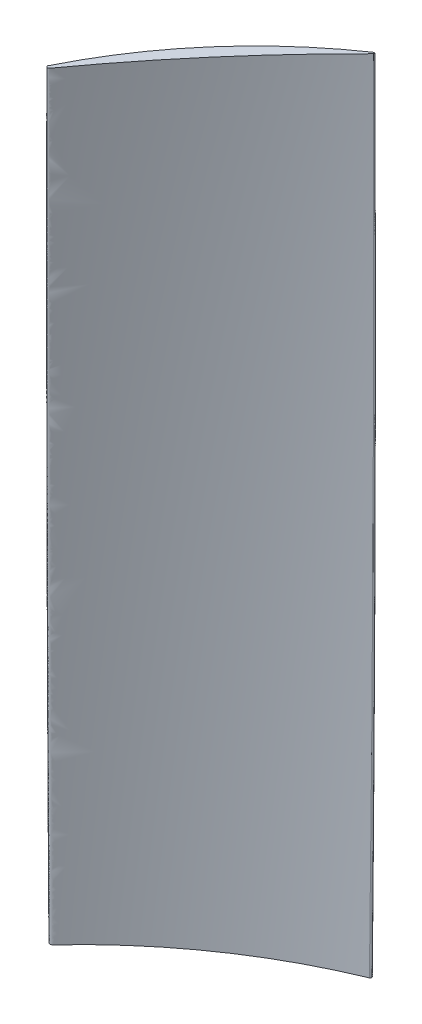
ISO-10303-21;
HEADER;
FILE_DESCRIPTION(('STEP AP214'),'2;1');
FILE_NAME('part.step','',(''),(''),'','','');
FILE_SCHEMA(('AUTOMOTIVE_DESIGN { 1 0 10303 214 1 1 1 1 }'));
ENDSEC;
DATA;
#1=APPLICATION_CONTEXT('core data for automotive mechanical design processes');
#2=APPLICATION_PROTOCOL_DEFINITION('international standard','automotive_design',2000,#1);
#3=PRODUCT_CONTEXT('',#1,'mechanical');
#4=PRODUCT('Part','Part','',(#3));
#5=PRODUCT_RELATED_PRODUCT_CATEGORY('part','',(#4));
#6=PRODUCT_DEFINITION_FORMATION('','',#4);
#7=PRODUCT_DEFINITION_CONTEXT('part definition',#1,'design');
#8=PRODUCT_DEFINITION('design','',#6,#7);
#9=PRODUCT_DEFINITION_SHAPE('','',#8);
#10=(LENGTH_UNIT() NAMED_UNIT(*) SI_UNIT(.MILLI.,.METRE.));
#11=(NAMED_UNIT(*) PLANE_ANGLE_UNIT() SI_UNIT($,.RADIAN.));
#12=(NAMED_UNIT(*) SI_UNIT($,.STERADIAN.) SOLID_ANGLE_UNIT());
#13=UNCERTAINTY_MEASURE_WITH_UNIT(LENGTH_MEASURE(1.E-05),#10,'distance_accuracy_value','');
#14=(GEOMETRIC_REPRESENTATION_CONTEXT(3) GLOBAL_UNCERTAINTY_ASSIGNED_CONTEXT((#13)) GLOBAL_UNIT_ASSIGNED_CONTEXT((#10,
#11,#12)) REPRESENTATION_CONTEXT('',''));
#15=CARTESIAN_POINT('',(0.,0.,0.));
#16=DIRECTION('',(0.,0.,1.));
#17=DIRECTION('',(1.,0.,0.));
#18=AXIS2_PLACEMENT_3D('',#15,#16,#17);
#19=CARTESIAN_POINT('',(21.7386034138477,422.,10.5574587035433));
#20=DIRECTION('',(0.,-1.,0.));
#21=DIRECTION('',(0.,0.,-1.));
#22=AXIS2_PLACEMENT_3D('',#19,#20,#21);
#23=PLANE('',#22);
#24=CARTESIAN_POINT('',(34.9313622856881,422.,29.8563887749535));
#25=DIRECTION('',(0.,1.,0.));
#26=DIRECTION('',(0.,0.,-1.));
#27=AXIS2_PLACEMENT_3D('',#24,#25,#26);
#28=CIRCLE('',#27,46.8445757568905);
#29=CARTESIAN_POINT('',(8.49505386412198,422.,-8.81577013663156));
#30=VERTEX_POINT('',#29);
#31=CARTESIAN_POINT('',(-7.04997074761576,422.,9.07221319375984));
#32=VERTEX_POINT('',#31);
#33=EDGE_CURVE('E212',#30,#32,#28,.T.);
#34=ORIENTED_EDGE('',*,*,#33,.T.);
#35=CARTESIAN_POINT('',(-6.95572437402814,422.,9.22556775373632));
#36=DIRECTION('',(0.,1.,0.));
#37=DIRECTION('',(0.,0.,1.));
#38=AXIS2_PLACEMENT_3D('',#35,#36,#37);
#39=CIRCLE('',#38,0.179999999999992);
#40=CARTESIAN_POINT('',(-6.80979712214955,422.,9.33094914279132));
#41=VERTEX_POINT('',#40);
#42=EDGE_CURVE('E275',#32,#41,#39,.T.);
#43=ORIENTED_EDGE('',*,*,#42,.T.);
#44=CARTESIAN_POINT('',(109.597584654928,422.,93.3945591265566));
#45=DIRECTION('',(0.,-1.,0.));
#46=DIRECTION('',(0.,0.,-1.));
#47=AXIS2_PLACEMENT_3D('',#44,#45,#46);
#48=CIRCLE('',#47,143.587496167657);
#49=CARTESIAN_POINT('',(8.60914364487819,422.,-8.6774930623584));
#50=VERTEX_POINT('',#49);
#51=EDGE_CURVE('E205',#41,#50,#48,.T.);
#52=ORIENTED_EDGE('',*,*,#51,.T.);
#53=CARTESIAN_POINT('',(8.54584454200725,422.,-8.74147136786686));
#54=DIRECTION('',(0.,1.,0.));
#55=DIRECTION('',(0.,0.,1.));
#56=AXIS2_PLACEMENT_3D('',#53,#54,#55);
#57=CIRCLE('',#56,0.0899999999999799);
#58=EDGE_CURVE('E209',#50,#30,#57,.T.);
#59=ORIENTED_EDGE('',*,*,#58,.T.);
#60=EDGE_LOOP('',(#34,#43,#52,#59));
#61=FACE_BOUND('',#60,.T.);
#62=ADVANCED_FACE('F167',(#61),#23,.F.);
#63=CARTESIAN_POINT('',(15.1224626774868,342.,10.7175696282854));
#64=DIRECTION('',(0.,-1.,0.));
#65=DIRECTION('',(0.,0.,-1.));
#66=AXIS2_PLACEMENT_3D('',#63,#64,#65);
#67=PLANE('',#66);
#68=CARTESIAN_POINT('',(19.3057491735808,342.,27.4352228342268));
#69=DIRECTION('',(0.,1.,0.));
#70=DIRECTION('',(0.,0.,-1.));
#71=AXIS2_PLACEMENT_3D('',#68,#69,#70);
#72=CIRCLE('',#71,34.6162045849278);
#73=CARTESIAN_POINT('',(10.9027641085955,342.,-6.14559701674188));
#74=VERTEX_POINT('',#73);
#75=CARTESIAN_POINT('',(-8.6912377469834,342.,7.07716931147229));
#76=VERTEX_POINT('',#75);
#77=EDGE_CURVE('E320',#74,#76,#72,.T.);
#78=ORIENTED_EDGE('',*,*,#77,.F.);
#79=CARTESIAN_POINT('',(10.9391761813929,342.,-6.00008357765601));
#80=DIRECTION('',(0.,1.,0.));
#81=DIRECTION('',(0.,0.,1.));
#82=AXIS2_PLACEMENT_3D('',#79,#80,#81);
#83=CIRCLE('',#82,0.150000000000004);
#84=CARTESIAN_POINT('',(10.9963050588019,342.,-5.86138861968712));
#85=VERTEX_POINT('',#84);
#86=EDGE_CURVE('E321',#85,#74,#83,.T.);
#87=ORIENTED_EDGE('',*,*,#86,.F.);
#88=CARTESIAN_POINT('',(31.8550502492999,342.,44.7785489860895));
#89=DIRECTION('',(0.,-1.,0.));
#90=DIRECTION('',(0.,0.,-1.));
#91=AXIS2_PLACEMENT_3D('',#88,#89,#90);
#92=CIRCLE('',#91,54.7676047644872);
#93=CARTESIAN_POINT('',(-8.27383653023069,342.,7.50707225823914));
#94=VERTEX_POINT('',#93);
#95=EDGE_CURVE('E178',#94,#85,#92,.T.);
#96=ORIENTED_EDGE('',*,*,#95,.F.);
#97=CARTESIAN_POINT('',(-8.49365016067205,342.,7.30291063630153));
#98=DIRECTION('',(0.,1.,0.));
#99=DIRECTION('',(0.,0.,1.));
#100=AXIS2_PLACEMENT_3D('',#97,#98,#99);
#101=CIRCLE('',#100,0.300000000000008);
#102=EDGE_CURVE('E12',#76,#94,#101,.T.);
#103=ORIENTED_EDGE('',*,*,#102,.F.);
#104=EDGE_LOOP('',(#78,#87,#96,#103));
#105=FACE_BOUND('',#104,.T.);
#106=ADVANCED_FACE('F247',(#105),#67,.T.);
#107=CARTESIAN_POINT('',(10.9963050588019,342.,-5.86138861968712));
#108=CARTESIAN_POINT('',(10.7431055873118,355.336110052146,-6.29543546217974));
#109=CARTESIAN_POINT('',(10.0921322366934,382.0026594558,-7.19873117281135));
#110=CARTESIAN_POINT('',(9.151664644696,408.669443385479,-8.1728384239606));
#111=CARTESIAN_POINT('',(8.60914364487818,422.,-8.67749306235842));
#112=CARTESIAN_POINT('',(11.0240391001485,342.,-5.87281235614697));
#113=CARTESIAN_POINT('',(10.768902718784,355.336113719176,-6.30905743029379));
#114=CARTESIAN_POINT('',(10.1173907243369,382.00265578877,-7.21314222859905));
#115=CARTESIAN_POINT('',(9.17608382619533,408.669447052509,-8.19405362161562));
#116=CARTESIAN_POINT('',(8.63016453067378,422.,-8.69829078749101));
#117=CARTESIAN_POINT('',(11.0821376427116,342.,-5.91474447130142));
#118=CARTESIAN_POINT('',(10.8231274415982,355.336121053236,-6.35538600875665));
#119=CARTESIAN_POINT('',(10.1564369010795,382.002648454709,-7.26894073178785));
#120=CARTESIAN_POINT('',(9.19521984054264,408.669454386569,-8.24143723414788));
#121=CARTESIAN_POINT('',(8.64250395361366,422.,-8.7448394549784));
#122=CARTESIAN_POINT('',(11.1015180060171,342.,-6.05351482276684));
#123=CARTESIAN_POINT('',(10.8287023615262,355.336080806391,-6.47889404169865));
#124=CARTESIAN_POINT('',(10.1427491498693,382.002688701556,-7.36223444155065));
#125=CARTESIAN_POINT('',(9.175159027118,408.669414139726,-8.31233880103584));
#126=CARTESIAN_POINT('',(8.62037535659384,422.,-8.80314223566519));
#127=CARTESIAN_POINT('',(11.0035076029829,342.,-6.15364858243242));
#128=CARTESIAN_POINT('',(10.7406391520146,355.336094511744,-6.5657402291417));
#129=CARTESIAN_POINT('',(10.0718284539581,382.002674996202,-7.42427174156044));
#130=CARTESIAN_POINT('',(9.1159320254959,408.669427845077,-8.35303999661501));
#131=CARTESIAN_POINT('',(8.56752979196351,422.,-8.83573899248198));
#132=CARTESIAN_POINT('',(10.9318616028507,342.,-6.15287813169793));
#133=CARTESIAN_POINT('',(10.6700155479912,355.336043322587,-6.56371004563089));
#134=CARTESIAN_POINT('',(10.0060614338301,382.002726185361,-7.4223101897415));
#135=CARTESIAN_POINT('',(9.06306822692208,408.66937665592,-8.35163129976833));
#136=CARTESIAN_POINT('',(8.51946566935102,422.,-8.83245805968333));
#137=CARTESIAN_POINT('',(8.9453736516334,342.,-5.65579590857662));
#138=CARTESIAN_POINT('',(8.71819486907609,355.334317558811,-6.02253674368728));
#139=CARTESIAN_POINT('',(8.15047473023794,382.004451949172,-6.64406289643751));
#140=CARTESIAN_POINT('',(7.23462235447163,408.667650892145,-7.27755269851949));
#141=CARTESIAN_POINT('',(6.85287003109743,422.,-7.69317239405399));
#142=CARTESIAN_POINT('',(5.12742336276286,341.999999999999,-4.33619793398498));
#143=CARTESIAN_POINT('',(4.93777369524597,355.333777418815,-4.47154007704064));
#144=CARTESIAN_POINT('',(4.50685037769147,382.00499208918,-4.79596007069921));
#145=CARTESIAN_POINT('',(4.02887813587027,408.667110752149,-5.11710160180071));
#146=CARTESIAN_POINT('',(3.70268636423304,422.000000000001,-5.23211247373463));
#147=CARTESIAN_POINT('',(-0.155627870878272,342.,-1.40339145090583));
#148=CARTESIAN_POINT('',(-0.228314154670056,355.33315787878,-1.3600312839794));
#149=CARTESIAN_POINT('',(-0.361821652963398,382.005611629227,-1.23028694535407));
#150=CARTESIAN_POINT('',(-0.484482591436304,408.666491212113,-1.04715594245007));
#151=CARTESIAN_POINT('',(-0.524285444951787,422.,-0.955296724634889));
#152=CARTESIAN_POINT('',(-4.85222622302284,342.,2.39844338547263));
#153=CARTESIAN_POINT('',(-4.79597059385519,355.333788031342,2.61437318929367));
#154=CARTESIAN_POINT('',(-4.62478595822992,382.004981476653,3.06147978867005));
#155=CARTESIAN_POINT('',(-4.34032763781035,408.667121364676,3.55835540497831));
#156=CARTESIAN_POINT('',(-4.16974845379276,422.,3.82686210570131));
#157=CARTESIAN_POINT('',(-7.50458834814428,342.,5.44525456768501));
#158=CARTESIAN_POINT('',(-7.35161107396262,355.334092632094,5.72973936259935));
#159=CARTESIAN_POINT('',(-6.97880145070307,382.004676875895,6.33016685724953));
#160=CARTESIAN_POINT('',(-6.45474685992586,408.667425965426,6.96917067211163));
#161=CARTESIAN_POINT('',(-6.16738652985297,422.,7.28950779699809));
#162=CARTESIAN_POINT('',(-8.69123774698339,342.,7.07716931147229));
#163=CARTESIAN_POINT('',(-8.48989965029472,355.334244932468,7.39593160193328));
#164=CARTESIAN_POINT('',(-8.01496163344523,382.004524575516,8.04726857304268));
#165=CARTESIAN_POINT('',(-7.3957216507163,408.667578265802,8.72596085679165));
#166=CARTESIAN_POINT('',(-7.04997074761576,422.,9.07221319375984));
#167=B_SPLINE_SURFACE_WITH_KNOTS('',3,3,((#107,#108,#109,#110,#111),(#112,#113,#114,#115,#116),
(#117,#118,#119,#120,#121),(#122,#123,#124,#125,#126),(#127,#128,#129,#130,#131),(#132,#133,
#134,#135,#136),(#137,#138,#139,#140,#141),(#142,#143,#144,#145,#146),(#147,#148,#149,#150,
#151),(#152,#153,#154,#155,#156),(#157,#158,#159,#160,#161),(#162,#163,#164,#165,#166)),
.UNSPECIFIED.,.F.,.F.,.F.,(4,1,1,1,2,1,1,1,4),(4,1,4),(0.,0.00366192683995283,
0.00732385367990566,0.0109857805198585,0.0146477073598113,0.260985780519858,0.507323853679906,
0.753661926839953,1.),(0.,0.499949035862994,1.),.UNSPECIFIED.);
#168=CARTESIAN_POINT('',(-8.69123774698339,342.,7.07716931147229));
#169=CARTESIAN_POINT('',(-8.48989965029472,355.334244932468,7.39593160193328));
#170=CARTESIAN_POINT('',(-8.01496163344523,382.004524575516,8.04726857304268));
#171=CARTESIAN_POINT('',(-7.3957216507163,408.667578265802,8.72596085679165));
#172=CARTESIAN_POINT('',(-7.04997074761576,422.,9.07221319375984));
#173=B_SPLINE_CURVE_WITH_KNOTS('',3,(#168,#169,#170,#171,#172),.UNSPECIFIED.,.F.,.F.,(4,1,4),
(0.,0.499949035862994,1.),.UNSPECIFIED.);
#174=EDGE_CURVE('E223',#76,#32,#173,.T.);
#175=CARTESIAN_POINT('',(10.9963050588019,342.,-5.86138861968712));
#176=CARTESIAN_POINT('',(10.7431055873118,355.336110052146,-6.29543546217974));
#177=CARTESIAN_POINT('',(10.0921322366934,382.0026594558,-7.19873117281135));
#178=CARTESIAN_POINT('',(9.151664644696,408.669443385479,-8.1728384239606));
#179=CARTESIAN_POINT('',(8.60914364487818,422.,-8.67749306235842));
#180=B_SPLINE_CURVE_WITH_KNOTS('',3,(#175,#176,#177,#178,#179),.UNSPECIFIED.,.F.,.F.,(4,1,4),
(0.,0.499949035862994,1.),.UNSPECIFIED.);
#181=EDGE_CURVE('E292',#50,#85,#180,.F.);
#182=ORIENTED_EDGE('',*,*,#86,.T.);
#183=ORIENTED_EDGE('',*,*,#77,.T.);
#184=ORIENTED_EDGE('',*,*,#174,.T.);
#185=ORIENTED_EDGE('',*,*,#33,.F.);
#186=ORIENTED_EDGE('',*,*,#58,.F.);
#187=ORIENTED_EDGE('',*,*,#181,.T.);
#188=EDGE_LOOP('',(#182,#183,#184,#185,#186,#187));
#189=FACE_BOUND('',#188,.T.);
#190=ADVANCED_FACE('F221',(#189),#167,.T.);
#191=CARTESIAN_POINT('',(-8.6912377469834,342.,7.07716931147229));
#192=CARTESIAN_POINT('',(-8.48989965029472,355.334244932468,7.39593160193328));
#193=CARTESIAN_POINT('',(-8.01496163344523,382.004524575516,8.04726857304269));
#194=CARTESIAN_POINT('',(-7.3957216507163,408.667578265802,8.72596085679165));
#195=CARTESIAN_POINT('',(-7.04997074761576,422.,9.07221319375984));
#196=CARTESIAN_POINT('',(-8.71667055065804,342.,7.09943021693567));
#197=CARTESIAN_POINT('',(-8.51570487583037,355.334244306148,7.41769097628649));
#198=CARTESIAN_POINT('',(-8.04180857402105,382.004525201837,8.06687489568473));
#199=CARTESIAN_POINT('',(-7.42466538780611,408.667577639481,8.74468707794447));
#200=CARTESIAN_POINT('',(-7.07848722068786,422.,9.08973842532105));
#201=CARTESIAN_POINT('',(-8.76276985769064,342.,7.15502361633816));
#202=CARTESIAN_POINT('',(-8.56254902658497,355.334243053507,7.47228131346863));
#203=CARTESIAN_POINT('',(-8.08832264668409,382.004526454478,8.1199307218411));
#204=CARTESIAN_POINT('',(-7.46653435528567,408.66757638684,8.79192224446841));
#205=CARTESIAN_POINT('',(-7.119501660132,422.,9.13457161266176));
#206=CARTESIAN_POINT('',(-8.80043430387407,342.000000000001,7.26932102719222));
#207=CARTESIAN_POINT('',(-8.59912679888015,355.334252890391,7.58208426731608));
#208=CARTESIAN_POINT('',(-8.12116335816976,382.004516617594,8.2189345588627));
#209=CARTESIAN_POINT('',(-7.49278498259349,408.667586223724,8.87861637897079));
#210=CARTESIAN_POINT('',(-7.14071939347863,422.,9.21409501144296));
#211=CARTESIAN_POINT('',(-8.78794998475702,342.,7.40029132064822));
#212=CARTESIAN_POINT('',(-8.58576594913013,355.334231664692,7.70408822832419));
#213=CARTESIAN_POINT('',(-8.1070944054972,382.004537843292,8.32273231057102));
#214=CARTESIAN_POINT('',(-7.48001919983528,408.667564998026,8.96309890789738));
#215=CARTESIAN_POINT('',(-7.12938479528623,422.,9.28881747310945));
#216=CARTESIAN_POINT('',(-8.71649537939251,342.000000000001,7.51922122739454));
#217=CARTESIAN_POINT('',(-8.52088172598598,355.334228695091,7.81313196987881));
#218=CARTESIAN_POINT('',(-8.0543166429315,382.004540812894,8.41244450115532));
#219=CARTESIAN_POINT('',(-7.43733593535095,408.667562028423,9.03451946006137));
#220=CARTESIAN_POINT('',(-7.09115914151947,422.,9.35128611349394));
#221=CARTESIAN_POINT('',(-8.5997514654597,342.,7.59417817551167));
#222=CARTESIAN_POINT('',(-8.41439947409751,355.334212954079,7.88214608854612));
#223=CARTESIAN_POINT('',(-7.96767921172371,382.004556553906,8.47014852196267));
#224=CARTESIAN_POINT('',(-7.36902412041269,408.667546287413,9.08202249476025));
#225=CARTESIAN_POINT('',(-7.03170370814303,422.,9.39404804842913));
#226=CARTESIAN_POINT('',(-8.46919958335583,342.,7.61056663097508));
#227=CARTESIAN_POINT('',(-8.29300426454032,355.33416435641,7.90018256629632));
#228=CARTESIAN_POINT('',(-7.86478641733082,382.004605151577,8.48995320462361));
#229=CARTESIAN_POINT('',(-7.28558696432292,408.667497689743,9.10054384214728));
#230=CARTESIAN_POINT('',(-6.95803009210798,422.,9.41090383954088));
#231=CARTESIAN_POINT('',(-8.35379595013459,342.,7.57629605295309));
#232=CARTESIAN_POINT('',(-8.1818435351699,355.334152340824,7.86784942075367));
#233=CARTESIAN_POINT('',(-7.76412190341892,382.004617167163,8.46257450814341));
#234=CARTESIAN_POINT('',(-7.19730690167284,408.667485674157,9.08024571292411));
#235=CARTESIAN_POINT('',(-6.87714989036541,422.,9.39565404845504));
#236=CARTESIAN_POINT('',(-8.29683808943817,342.,7.53183722722412));
#237=CARTESIAN_POINT('',(-8.12546706374755,355.334149113943,7.82307702995146));
#238=CARTESIAN_POINT('',(-7.70861919830342,382.004620394044,8.41902360547061));
#239=CARTESIAN_POINT('',(-7.14739809811446,408.667482447276,9.0416719864865));
#240=CARTESIAN_POINT('',(-6.82939292382476,422.,9.35808449859241));
#241=CARTESIAN_POINT('',(-6.924184673816,342.,6.05394962150234));
#242=CARTESIAN_POINT('',(-6.7706232210266,355.334051638163,6.33519690432827));
#243=CARTESIAN_POINT('',(-6.45605621247853,382.004717869824,6.88182175080432));
#244=CARTESIAN_POINT('',(-5.91445512474997,408.6673849715,7.39403575449162));
#245=CARTESIAN_POINT('',(-5.6599833096303,422.,7.73874039191404));
#246=CARTESIAN_POINT('',(-4.08115404996455,342.,3.309295355785));
#247=CARTESIAN_POINT('',(-4.01591462483236,355.333722501721,3.49747420928882));
#248=CARTESIAN_POINT('',(-3.79441681697069,382.005047006276,3.90512646011137));
#249=CARTESIAN_POINT('',(-3.49009898753418,408.667055835053,4.37728170301538));
#250=CARTESIAN_POINT('',(-3.28282489438081,422.000000000001,4.58483846553681));
#251=CARTESIAN_POINT('',(0.577125069318818,341.999999999999,-0.307422565401319));
#252=CARTESIAN_POINT('',(0.544535356114775,355.333237588167,-0.267056104745701));
#253=CARTESIAN_POINT('',(0.492007067133292,382.005531919839,-0.179167235441145));
#254=CARTESIAN_POINT('',(0.492842104118354,408.6665709215,-0.0812102519756189));
#255=CARTESIAN_POINT('',(0.496041412940421,421.999999999999,-0.0188640710630824));
#256=CARTESIAN_POINT('',(5.59610540681138,342.,-3.40420303008471));
#257=CARTESIAN_POINT('',(5.45288835784445,355.333322589211,-3.56923950100413));
#258=CARTESIAN_POINT('',(5.12324410051688,382.005446918793,-3.91502518420433));
#259=CARTESIAN_POINT('',(4.69433248806332,408.666655922544,-4.27754829118777));
#260=CARTESIAN_POINT('',(4.46284101603828,422.,-4.46165694525457));
#261=CARTESIAN_POINT('',(9.16256269604517,342.,-5.10606453166137));
#262=CARTESIAN_POINT('',(8.9460240320628,355.335180897834,-5.45044125029626));
#263=CARTESIAN_POINT('',(8.40288705139026,382.003588610131,-6.14917098905866));
#264=CARTESIAN_POINT('',(7.65185661667268,408.668514231168,-6.89837709407069));
#265=CARTESIAN_POINT('',(7.21301212611913,422.,-7.29618307102482));
#266=CARTESIAN_POINT('',(10.9963050588019,342.,-5.86138861968712));
#267=CARTESIAN_POINT('',(10.7431055873118,355.336110052146,-6.29543546217975));
#268=CARTESIAN_POINT('',(10.0921322366934,382.0026594558,-7.19873117281138));
#269=CARTESIAN_POINT('',(9.151664644696,408.669443385479,-8.17283842396061));
#270=CARTESIAN_POINT('',(8.60914364487819,422.,-8.6774930623584));
#271=B_SPLINE_SURFACE_WITH_KNOTS('',3,3,((#191,#192,#193,#194,#195),(#196,#197,#198,#199,#200),
(#201,#202,#203,#204,#205),(#206,#207,#208,#209,#210),(#211,#212,#213,#214,#215),(#216,#217,
#218,#219,#220),(#221,#222,#223,#224,#225),(#226,#227,#228,#229,#230),(#231,#232,#233,#234,
#235),(#236,#237,#238,#239,#240),(#241,#242,#243,#244,#245),(#246,#247,#248,#249,#250),(#251,
#252,#253,#254,#255),(#256,#257,#258,#259,#260),(#261,#262,#263,#264,#265),(#266,#267,#268,#269,
#270)),.UNSPECIFIED.,.F.,.F.,.F.,(4,1,1,1,1,1,1,1,2,1,1,1,4),(4,1,4),(0.,0.00412020868755786,
0.00824041737511572,0.0123606260626736,0.0164808347502314,0.0206010434377893,0.0247212521253472,
0.028841460812905,0.0329616695004629,0.274721252125347,0.516480834750231,0.758240417375116,1.),
(0.,0.499949035862994,1.),.UNSPECIFIED.);
#272=ORIENTED_EDGE('',*,*,#102,.T.);
#273=ORIENTED_EDGE('',*,*,#95,.T.);
#274=ORIENTED_EDGE('',*,*,#181,.F.);
#275=ORIENTED_EDGE('',*,*,#51,.F.);
#276=ORIENTED_EDGE('',*,*,#42,.F.);
#277=ORIENTED_EDGE('',*,*,#174,.F.);
#278=EDGE_LOOP('',(#272,#273,#274,#275,#276,#277));
#279=FACE_BOUND('',#278,.T.);
#280=ADVANCED_FACE('F246',(#279),#271,.T.);
#281=CLOSED_SHELL('',(#62,#106,#190,#280));
#282=MANIFOLD_SOLID_BREP('B2',#281);
#283=ADVANCED_BREP_SHAPE_REPRESENTATION('',(#18,#282),#14);
#284=SHAPE_DEFINITION_REPRESENTATION(#9,#283);
ENDSEC;
END-ISO-10303-21;
